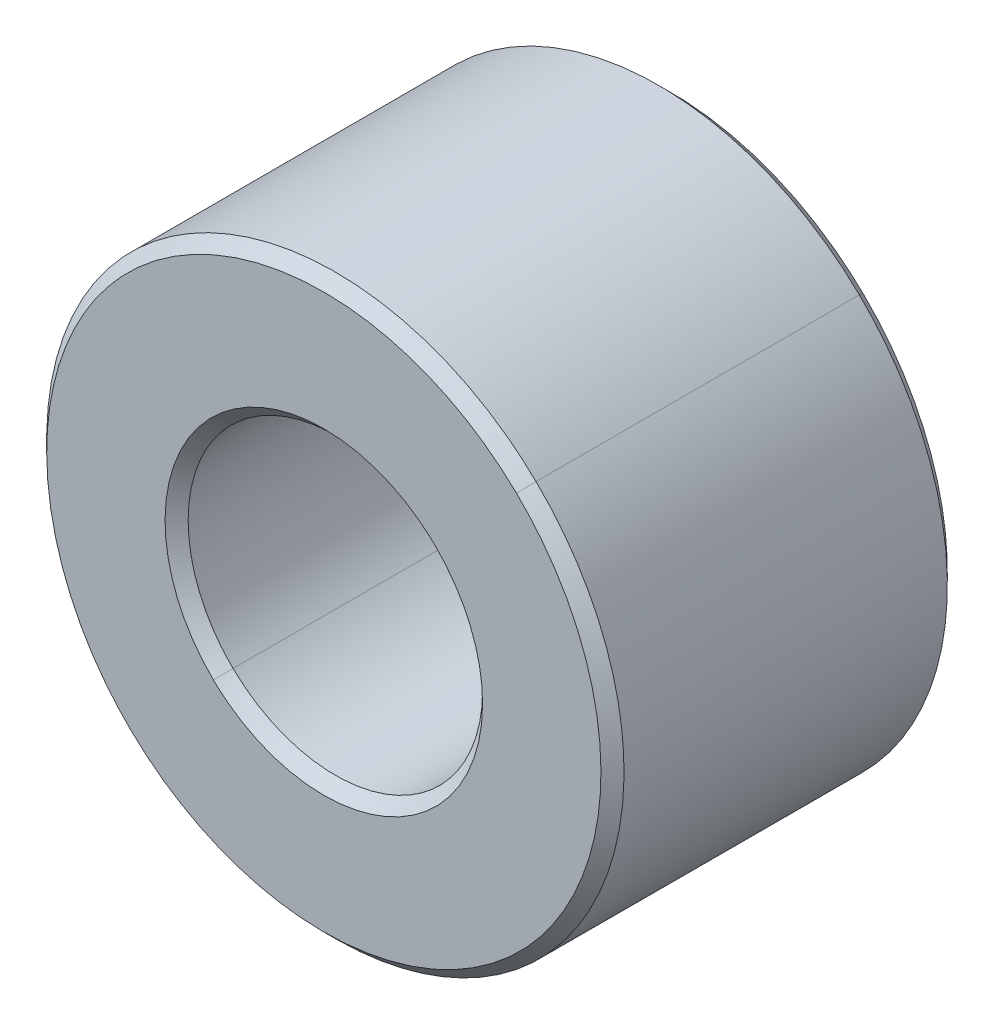
ISO-10303-21;
HEADER;
FILE_DESCRIPTION(('STEP AP214'),'2;1');
FILE_NAME('part.step','',(''),(''),'','','');
FILE_SCHEMA(('AUTOMOTIVE_DESIGN { 1 0 10303 214 1 1 1 1 }'));
ENDSEC;
DATA;
#1=APPLICATION_CONTEXT('core data for automotive mechanical design processes');
#2=APPLICATION_PROTOCOL_DEFINITION('international standard','automotive_design',2000,#1);
#3=PRODUCT_CONTEXT('',#1,'mechanical');
#4=PRODUCT('Part','Part','',(#3));
#5=PRODUCT_RELATED_PRODUCT_CATEGORY('part','',(#4));
#6=PRODUCT_DEFINITION_FORMATION('','',#4);
#7=PRODUCT_DEFINITION_CONTEXT('part definition',#1,'design');
#8=PRODUCT_DEFINITION('design','',#6,#7);
#9=PRODUCT_DEFINITION_SHAPE('','',#8);
#10=(LENGTH_UNIT() NAMED_UNIT(*) SI_UNIT(.MILLI.,.METRE.));
#11=(NAMED_UNIT(*) PLANE_ANGLE_UNIT() SI_UNIT($,.RADIAN.));
#12=(NAMED_UNIT(*) SI_UNIT($,.STERADIAN.) SOLID_ANGLE_UNIT());
#13=UNCERTAINTY_MEASURE_WITH_UNIT(LENGTH_MEASURE(1.E-05),#10,'distance_accuracy_value','');
#14=(GEOMETRIC_REPRESENTATION_CONTEXT(3) GLOBAL_UNCERTAINTY_ASSIGNED_CONTEXT((#13)) GLOBAL_UNIT_ASSIGNED_CONTEXT((#10,
#11,#12)) REPRESENTATION_CONTEXT('',''));
#15=CARTESIAN_POINT('',(0.,0.,0.));
#16=DIRECTION('',(0.,0.,1.));
#17=DIRECTION('',(1.,0.,0.));
#18=AXIS2_PLACEMENT_3D('',#15,#16,#17);
#19=CARTESIAN_POINT('',(212.552183604006,-419.836966821952,256.381305856301));
#20=CARTESIAN_POINT('',(212.691221182538,-419.693201207996,256.581305856301));
#21=CARTESIAN_POINT('',(209.101808869065,-416.500064937198,256.381305856301));
#22=CARTESIAN_POINT('',(209.09708083364,-416.21726174471,256.581305856301));
#23=CARTESIAN_POINT('',(205.76490698431,-419.950439672139,256.381305856301));
#24=CARTESIAN_POINT('',(205.621141370354,-419.811402093608,256.581305856301));
#25=CARTESIAN_POINT('',(202.428005099556,-423.400814407081,256.381305856301));
#26=CARTESIAN_POINT('',(202.145201907068,-423.405542442505,256.581305856301));
#27=CARTESIAN_POINT('',(205.878379834497,-426.737716291835,256.381305856301));
#28=CARTESIAN_POINT('',(205.739342255966,-426.881481905791,256.581305856301));
#29=(BOUNDED_SURFACE() B_SPLINE_SURFACE(2,1,((#19,#20),(#21,#22),(#23,#24),(#25,#26),(#27,#28)),
.UNSPECIFIED.,.F.,.F.,.F.) B_SPLINE_SURFACE_WITH_KNOTS((3,2,3),(2,2),(1.57079632679488,
3.14159265358979,4.71238898038471),(0.,0.282842712474619),
.UNSPECIFIED.) GEOMETRIC_REPRESENTATION_ITEM() RATIONAL_B_SPLINE_SURFACE(((1.,1.),
(0.707106781186541,0.707106781186541),(1.,1.),(0.707106781186541,0.707106781186541),(1.,1.))) REPRESENTATION_ITEM('') SURFACE());
#30=CARTESIAN_POINT('',(205.878379834497,-426.737716291835,256.381305856301));
#31=CARTESIAN_POINT('',(205.739342255966,-426.881481905791,256.581305856301));
#32=(BOUNDED_CURVE() B_SPLINE_CURVE(1,(#30,#31),.UNSPECIFIED.,.F.,
.F.) B_SPLINE_CURVE_WITH_KNOTS((2,2),(0.,0.282842712474629),
.UNSPECIFIED.) CURVE() GEOMETRIC_REPRESENTATION_ITEM() RATIONAL_B_SPLINE_CURVE((1.,1.)) REPRESENTATION_ITEM(''));
#33=CARTESIAN_POINT('',(205.878379834497,-426.737716291835,256.381305856301));
#34=VERTEX_POINT('',#33);
#35=CARTESIAN_POINT('',(205.739342255966,-426.881481905791,256.581305856301));
#36=VERTEX_POINT('',#35);
#37=EDGE_CURVE('E233',#34,#36,#32,.T.);
#38=CARTESIAN_POINT('',(212.691221182538,-419.693201207996,256.581305856301));
#39=CARTESIAN_POINT('',(209.09708083364,-416.21726174471,256.581305856301));
#40=CARTESIAN_POINT('',(205.621141370354,-419.811402093608,256.581305856301));
#41=CARTESIAN_POINT('',(202.145201907068,-423.405542442505,256.581305856301));
#42=CARTESIAN_POINT('',(205.739342255966,-426.881481905791,256.581305856301));
#43=(BOUNDED_CURVE() B_SPLINE_CURVE(2,(#38,#39,#40,#41,#42),.UNSPECIFIED.,.F.,
.F.) B_SPLINE_CURVE_WITH_KNOTS((3,2,3),(0.,7.85398163397448,15.707963267949),
.UNSPECIFIED.) CURVE() GEOMETRIC_REPRESENTATION_ITEM() RATIONAL_B_SPLINE_CURVE((1.,
0.707106781186548,1.,0.707106781186548,1.)) REPRESENTATION_ITEM(''));
#44=CARTESIAN_POINT('',(212.691221182538,-419.693201207996,256.581305856301));
#45=VERTEX_POINT('',#44);
#46=EDGE_CURVE('E277',#45,#36,#43,.T.);
#47=CARTESIAN_POINT('',(212.552183604006,-419.836966821952,256.381305856301));
#48=CARTESIAN_POINT('',(212.691221182538,-419.693201207996,256.581305856301));
#49=(BOUNDED_CURVE() B_SPLINE_CURVE(1,(#47,#48),.UNSPECIFIED.,.F.,
.F.) B_SPLINE_CURVE_WITH_KNOTS((2,2),(0.,0.282842712474629),
.UNSPECIFIED.) CURVE() GEOMETRIC_REPRESENTATION_ITEM() RATIONAL_B_SPLINE_CURVE((1.,1.)) REPRESENTATION_ITEM(''));
#50=CARTESIAN_POINT('',(212.552183604006,-419.836966821952,256.381305856301));
#51=VERTEX_POINT('',#50);
#52=EDGE_CURVE('E242',#51,#45,#49,.T.);
#53=CARTESIAN_POINT('',(205.878379834497,-426.737716291835,256.381305856301));
#54=CARTESIAN_POINT('',(202.428005099556,-423.400814407081,256.381305856301));
#55=CARTESIAN_POINT('',(205.76490698431,-419.950439672139,256.381305856301));
#56=CARTESIAN_POINT('',(209.101808869065,-416.500064937198,256.381305856301));
#57=CARTESIAN_POINT('',(212.552183604006,-419.836966821952,256.381305856301));
#58=(BOUNDED_CURVE() B_SPLINE_CURVE(2,(#53,#54,#55,#56,#57),.UNSPECIFIED.,.F.,
.F.) B_SPLINE_CURVE_WITH_KNOTS((3,2,3),(0.,7.5398223686155,15.079644737231),
.UNSPECIFIED.) CURVE() GEOMETRIC_REPRESENTATION_ITEM() RATIONAL_B_SPLINE_CURVE((1.,
0.707106781186548,1.,0.707106781186548,1.)) REPRESENTATION_ITEM(''));
#59=EDGE_CURVE('E574',#34,#51,#58,.T.);
#60=ORIENTED_EDGE('',*,*,#37,.T.);
#61=ORIENTED_EDGE('',*,*,#46,.F.);
#62=ORIENTED_EDGE('',*,*,#52,.F.);
#63=ORIENTED_EDGE('',*,*,#59,.F.);
#64=EDGE_LOOP('',(#60,#61,#62,#63));
#65=FACE_BOUND('',#64,.T.);
#66=ADVANCED_FACE('F51',(#65),#29,.T.);
#67=CARTESIAN_POINT('',(207.442552592976,-425.120353134831,256.581305856301));
#68=CARTESIAN_POINT('',(205.609541015038,-423.347624008555,256.581305856301));
#69=CARTESIAN_POINT('',(207.382270141314,-421.514612430618,256.581305856301));
#70=CARTESIAN_POINT('',(209.15499926759,-419.68160085268,256.581305856301));
#71=CARTESIAN_POINT('',(210.988010845528,-421.454329978956,256.581305856301));
#72=CARTESIAN_POINT('',(207.303515014444,-425.264118748787,256.381305856301));
#73=CARTESIAN_POINT('',(205.326737822551,-423.35235204398,256.381305856301));
#74=CARTESIAN_POINT('',(207.238504527358,-421.375574852086,256.381305856301));
#75=CARTESIAN_POINT('',(209.150271232165,-419.398797660193,256.381305856301));
#76=CARTESIAN_POINT('',(211.127048424059,-421.310564365,256.381305856301));
#77=(BOUNDED_SURFACE() B_SPLINE_SURFACE(1,2,((#67,#68,#69,#70,#71),(#72,#73,#74,#75,#76)),
.UNSPECIFIED.,.F.,.F.,.F.) B_SPLINE_SURFACE_WITH_KNOTS((2,2),(3,2,3),(0.,0.282842712474621),
(1.5707963267949,3.14159265358979,4.71238898038469),
.UNSPECIFIED.) GEOMETRIC_REPRESENTATION_ITEM() RATIONAL_B_SPLINE_SURFACE(((1.,0.707106781186548,
1.,0.707106781186548,1.),(1.,0.707106781186548,1.,0.707106781186548,1.))) REPRESENTATION_ITEM('') SURFACE());
#78=CARTESIAN_POINT('',(210.988010845528,-421.454329978956,256.581305856301));
#79=CARTESIAN_POINT('',(211.127048424059,-421.310564365,256.381305856301));
#80=(BOUNDED_CURVE() B_SPLINE_CURVE(1,(#78,#79),.UNSPECIFIED.,.F.,
.F.) B_SPLINE_CURVE_WITH_KNOTS((2,2),(0.,0.282842712474615),
.UNSPECIFIED.) CURVE() GEOMETRIC_REPRESENTATION_ITEM() RATIONAL_B_SPLINE_CURVE((1.,1.)) REPRESENTATION_ITEM(''));
#81=CARTESIAN_POINT('',(210.988010845528,-421.454329978956,256.581305856301));
#82=VERTEX_POINT('',#81);
#83=CARTESIAN_POINT('',(211.127048424059,-421.310564365,256.381305856301));
#84=VERTEX_POINT('',#83);
#85=EDGE_CURVE('E122',#82,#84,#80,.T.);
#86=CARTESIAN_POINT('',(207.442552592976,-425.120353134831,256.581305856301));
#87=CARTESIAN_POINT('',(205.609541015038,-423.347624008555,256.581305856301));
#88=CARTESIAN_POINT('',(207.382270141314,-421.514612430618,256.581305856301));
#89=CARTESIAN_POINT('',(209.15499926759,-419.68160085268,256.581305856301));
#90=CARTESIAN_POINT('',(210.988010845528,-421.454329978956,256.581305856301));
#91=(BOUNDED_CURVE() B_SPLINE_CURVE(2,(#86,#87,#88,#89,#90),.UNSPECIFIED.,.F.,
.F.) B_SPLINE_CURVE_WITH_KNOTS((3,2,3),(0.,4.00553063332699,8.01106126665397),
.UNSPECIFIED.) CURVE() GEOMETRIC_REPRESENTATION_ITEM() RATIONAL_B_SPLINE_CURVE((1.,
0.707106781186548,1.,0.707106781186548,1.)) REPRESENTATION_ITEM(''));
#92=CARTESIAN_POINT('',(207.442552592976,-425.120353134831,256.581305856301));
#93=VERTEX_POINT('',#92);
#94=EDGE_CURVE('E57',#93,#82,#91,.T.);
#95=CARTESIAN_POINT('',(207.442552592976,-425.120353134831,256.581305856301));
#96=CARTESIAN_POINT('',(207.303515014444,-425.264118748787,256.381305856301));
#97=(BOUNDED_CURVE() B_SPLINE_CURVE(1,(#95,#96),.UNSPECIFIED.,.F.,
.F.) B_SPLINE_CURVE_WITH_KNOTS((2,2),(0.,0.282842712474615),
.UNSPECIFIED.) CURVE() GEOMETRIC_REPRESENTATION_ITEM() RATIONAL_B_SPLINE_CURVE((1.,1.)) REPRESENTATION_ITEM(''));
#98=CARTESIAN_POINT('',(207.303515014444,-425.264118748787,256.381305856301));
#99=VERTEX_POINT('',#98);
#100=EDGE_CURVE('E243',#93,#99,#97,.T.);
#101=CARTESIAN_POINT('',(211.127048424059,-421.310564365,256.381305856301));
#102=CARTESIAN_POINT('',(209.150271232165,-419.398797660193,256.381305856301));
#103=CARTESIAN_POINT('',(207.238504527358,-421.375574852086,256.381305856301));
#104=CARTESIAN_POINT('',(205.326737822551,-423.35235204398,256.381305856301));
#105=CARTESIAN_POINT('',(207.303515014444,-425.264118748787,256.381305856301));
#106=(BOUNDED_CURVE() B_SPLINE_CURVE(2,(#101,#102,#103,#104,#105),.UNSPECIFIED.,.F.,
.F.) B_SPLINE_CURVE_WITH_KNOTS((3,2,3),(0.,4.31968989868596,8.63937979737192),
.UNSPECIFIED.) CURVE() GEOMETRIC_REPRESENTATION_ITEM() RATIONAL_B_SPLINE_CURVE((1.,
0.707106781186548,1.,0.707106781186548,1.)) REPRESENTATION_ITEM(''));
#107=EDGE_CURVE('E616',#84,#99,#106,.T.);
#108=ORIENTED_EDGE('',*,*,#85,.F.);
#109=ORIENTED_EDGE('',*,*,#94,.F.);
#110=ORIENTED_EDGE('',*,*,#100,.T.);
#111=ORIENTED_EDGE('',*,*,#107,.F.);
#112=EDGE_LOOP('',(#108,#109,#110,#111));
#113=FACE_BOUND('',#112,.T.);
#114=ADVANCED_FACE('F53',(#113),#77,.T.);
#115=CARTESIAN_POINT('',(210.988010845528,-421.454329978956,262.181305856301));
#116=CARTESIAN_POINT('',(209.15499926759,-419.68160085268,262.181305856301));
#117=CARTESIAN_POINT('',(207.382270141314,-421.514612430618,262.181305856301));
#118=CARTESIAN_POINT('',(205.609541015038,-423.347624008555,262.181305856301));
#119=CARTESIAN_POINT('',(207.442552592976,-425.120353134831,262.181305856301));
#120=CARTESIAN_POINT('',(211.127048424059,-421.310564365,262.381305856301));
#121=CARTESIAN_POINT('',(209.150271232165,-419.398797660193,262.381305856301));
#122=CARTESIAN_POINT('',(207.238504527358,-421.375574852086,262.381305856301));
#123=CARTESIAN_POINT('',(205.326737822551,-423.35235204398,262.381305856301));
#124=CARTESIAN_POINT('',(207.303515014444,-425.264118748787,262.381305856301));
#125=(BOUNDED_SURFACE() B_SPLINE_SURFACE(1,2,((#115,#116,#117,#118,#119),(#120,#121,#122,#123,
#124)),.UNSPECIFIED.,.F.,.F.,.F.) B_SPLINE_SURFACE_WITH_KNOTS((2,2),(3,2,3),(-0.282842712474623,
0.),(1.57079632679488,3.14159265358979,4.71238898038471),
.UNSPECIFIED.) GEOMETRIC_REPRESENTATION_ITEM() RATIONAL_B_SPLINE_SURFACE(((1.,0.707106781186541,
1.,0.707106781186541,1.),(1.,0.707106781186541,1.,0.707106781186541,1.))) REPRESENTATION_ITEM('') SURFACE());
#126=CARTESIAN_POINT('',(207.442552592976,-425.120353134831,262.181305856301));
#127=CARTESIAN_POINT('',(207.303515014444,-425.264118748787,262.381305856301));
#128=(BOUNDED_CURVE() B_SPLINE_CURVE(1,(#126,#127),.UNSPECIFIED.,.F.,
.F.) B_SPLINE_CURVE_WITH_KNOTS((2,2),(0.,0.282842712474615),
.UNSPECIFIED.) CURVE() GEOMETRIC_REPRESENTATION_ITEM() RATIONAL_B_SPLINE_CURVE((1.,1.)) REPRESENTATION_ITEM(''));
#129=CARTESIAN_POINT('',(207.442552592976,-425.120353134831,262.181305856301));
#130=VERTEX_POINT('',#129);
#131=CARTESIAN_POINT('',(207.303515014444,-425.264118748787,262.381305856301));
#132=VERTEX_POINT('',#131);
#133=EDGE_CURVE('E123',#130,#132,#128,.T.);
#134=CARTESIAN_POINT('',(210.988010845528,-421.454329978956,262.181305856301));
#135=CARTESIAN_POINT('',(209.15499926759,-419.68160085268,262.181305856301));
#136=CARTESIAN_POINT('',(207.382270141314,-421.514612430618,262.181305856301));
#137=CARTESIAN_POINT('',(205.609541015038,-423.347624008555,262.181305856301));
#138=CARTESIAN_POINT('',(207.442552592976,-425.120353134831,262.181305856301));
#139=(BOUNDED_CURVE() B_SPLINE_CURVE(2,(#134,#135,#136,#137,#138),.UNSPECIFIED.,.F.,
.F.) B_SPLINE_CURVE_WITH_KNOTS((3,2,3),(0.,4.00553063332699,8.01106126665397),
.UNSPECIFIED.) CURVE() GEOMETRIC_REPRESENTATION_ITEM() RATIONAL_B_SPLINE_CURVE((1.,
0.707106781186548,1.,0.707106781186548,1.)) REPRESENTATION_ITEM(''));
#140=CARTESIAN_POINT('',(210.988010845528,-421.454329978956,262.181305856301));
#141=VERTEX_POINT('',#140);
#142=EDGE_CURVE('E11',#141,#130,#139,.T.);
#143=CARTESIAN_POINT('',(210.988010845528,-421.454329978956,262.181305856301));
#144=CARTESIAN_POINT('',(211.127048424059,-421.310564365,262.381305856301));
#145=(BOUNDED_CURVE() B_SPLINE_CURVE(1,(#143,#144),.UNSPECIFIED.,.F.,
.F.) B_SPLINE_CURVE_WITH_KNOTS((2,2),(0.,0.282842712474615),
.UNSPECIFIED.) CURVE() GEOMETRIC_REPRESENTATION_ITEM() RATIONAL_B_SPLINE_CURVE((1.,1.)) REPRESENTATION_ITEM(''));
#146=CARTESIAN_POINT('',(211.127048424059,-421.310564365,262.381305856301));
#147=VERTEX_POINT('',#146);
#148=EDGE_CURVE('E113',#141,#147,#145,.T.);
#149=CARTESIAN_POINT('',(207.303515014444,-425.264118748787,262.381305856301));
#150=CARTESIAN_POINT('',(205.326737822551,-423.35235204398,262.381305856301));
#151=CARTESIAN_POINT('',(207.238504527358,-421.375574852086,262.381305856301));
#152=CARTESIAN_POINT('',(209.150271232165,-419.398797660193,262.381305856301));
#153=CARTESIAN_POINT('',(211.127048424059,-421.310564365,262.381305856301));
#154=(BOUNDED_CURVE() B_SPLINE_CURVE(2,(#149,#150,#151,#152,#153),.UNSPECIFIED.,.F.,
.F.) B_SPLINE_CURVE_WITH_KNOTS((3,2,3),(0.,4.31968989868596,8.63937979737192),
.UNSPECIFIED.) CURVE() GEOMETRIC_REPRESENTATION_ITEM() RATIONAL_B_SPLINE_CURVE((1.,
0.707106781186549,1.,0.707106781186549,1.)) REPRESENTATION_ITEM(''));
#155=EDGE_CURVE('E118',#132,#147,#154,.T.);
#156=ORIENTED_EDGE('',*,*,#133,.F.);
#157=ORIENTED_EDGE('',*,*,#142,.F.);
#158=ORIENTED_EDGE('',*,*,#148,.T.);
#159=ORIENTED_EDGE('',*,*,#155,.F.);
#160=EDGE_LOOP('',(#156,#157,#158,#159));
#161=FACE_BOUND('',#160,.T.);
#162=ADVANCED_FACE('F116',(#161),#125,.T.);
#163=CARTESIAN_POINT('',(205.878379834497,-426.737716291835,262.381305856301));
#164=CARTESIAN_POINT('',(205.739342255966,-426.881481905791,262.181305856301));
#165=CARTESIAN_POINT('',(202.428005099556,-423.40081440708,262.381305856301));
#166=CARTESIAN_POINT('',(202.145201907068,-423.405542442505,262.181305856301));
#167=CARTESIAN_POINT('',(205.76490698431,-419.950439672139,262.381305856301));
#168=CARTESIAN_POINT('',(205.621141370354,-419.811402093608,262.181305856301));
#169=CARTESIAN_POINT('',(209.101808869065,-416.500064937198,262.381305856301));
#170=CARTESIAN_POINT('',(209.09708083364,-416.21726174471,262.181305856301));
#171=CARTESIAN_POINT('',(212.552183604006,-419.836966821952,262.381305856301));
#172=CARTESIAN_POINT('',(212.691221182538,-419.693201207996,262.181305856301));
#173=(BOUNDED_SURFACE() B_SPLINE_SURFACE(2,1,((#163,#164),(#165,#166),(#167,#168),(#169,#170),
(#171,#172)),.UNSPECIFIED.,.F.,.F.,.F.) B_SPLINE_SURFACE_WITH_KNOTS((3,2,3),(2,2),
(1.5707963267949,3.14159265358979,4.71238898038469),(-0.282842712474616,0.),
.UNSPECIFIED.) GEOMETRIC_REPRESENTATION_ITEM() RATIONAL_B_SPLINE_SURFACE(((1.,1.),
(0.707106781186548,0.707106781186548),(1.,1.),(0.707106781186548,0.707106781186548),(1.,1.))) REPRESENTATION_ITEM('') SURFACE());
#174=CARTESIAN_POINT('',(212.552183604006,-419.836966821952,262.381305856301));
#175=CARTESIAN_POINT('',(212.691221182538,-419.693201207996,262.181305856301));
#176=(BOUNDED_CURVE() B_SPLINE_CURVE(1,(#174,#175),.UNSPECIFIED.,.F.,
.F.) B_SPLINE_CURVE_WITH_KNOTS((2,2),(0.,0.282842712474629),
.UNSPECIFIED.) CURVE() GEOMETRIC_REPRESENTATION_ITEM() RATIONAL_B_SPLINE_CURVE((1.,1.)) REPRESENTATION_ITEM(''));
#177=CARTESIAN_POINT('',(212.552183604006,-419.836966821952,262.381305856301));
#178=VERTEX_POINT('',#177);
#179=CARTESIAN_POINT('',(212.691221182538,-419.693201207996,262.181305856301));
#180=VERTEX_POINT('',#179);
#181=EDGE_CURVE('E177',#178,#180,#176,.T.);
#182=CARTESIAN_POINT('',(205.739342255966,-426.881481905791,262.181305856301));
#183=CARTESIAN_POINT('',(202.145201907068,-423.405542442505,262.181305856301));
#184=CARTESIAN_POINT('',(205.621141370354,-419.811402093608,262.181305856301));
#185=CARTESIAN_POINT('',(209.09708083364,-416.21726174471,262.181305856301));
#186=CARTESIAN_POINT('',(212.691221182538,-419.693201207996,262.181305856301));
#187=(BOUNDED_CURVE() B_SPLINE_CURVE(2,(#182,#183,#184,#185,#186),.UNSPECIFIED.,.F.,
.F.) B_SPLINE_CURVE_WITH_KNOTS((3,2,3),(0.,7.85398163397448,15.707963267949),
.UNSPECIFIED.) CURVE() GEOMETRIC_REPRESENTATION_ITEM() RATIONAL_B_SPLINE_CURVE((1.,
0.707106781186548,1.,0.707106781186548,1.)) REPRESENTATION_ITEM(''));
#188=CARTESIAN_POINT('',(205.739342255966,-426.881481905791,262.181305856301));
#189=VERTEX_POINT('',#188);
#190=EDGE_CURVE('E268',#189,#180,#187,.T.);
#191=CARTESIAN_POINT('',(205.878379834497,-426.737716291835,262.381305856301));
#192=CARTESIAN_POINT('',(205.739342255966,-426.881481905791,262.181305856301));
#193=(BOUNDED_CURVE() B_SPLINE_CURVE(1,(#191,#192),.UNSPECIFIED.,.F.,
.F.) B_SPLINE_CURVE_WITH_KNOTS((2,2),(0.,0.282842712474629),
.UNSPECIFIED.) CURVE() GEOMETRIC_REPRESENTATION_ITEM() RATIONAL_B_SPLINE_CURVE((1.,1.)) REPRESENTATION_ITEM(''));
#194=CARTESIAN_POINT('',(205.878379834497,-426.737716291835,262.381305856301));
#195=VERTEX_POINT('',#194);
#196=EDGE_CURVE('E195',#195,#189,#193,.T.);
#197=CARTESIAN_POINT('',(212.552183604006,-419.836966821952,262.381305856301));
#198=CARTESIAN_POINT('',(209.101808869065,-416.500064937198,262.381305856301));
#199=CARTESIAN_POINT('',(205.76490698431,-419.950439672139,262.381305856301));
#200=CARTESIAN_POINT('',(202.428005099556,-423.400814407081,262.381305856301));
#201=CARTESIAN_POINT('',(205.878379834497,-426.737716291835,262.381305856301));
#202=(BOUNDED_CURVE() B_SPLINE_CURVE(2,(#197,#198,#199,#200,#201),.UNSPECIFIED.,.F.,
.F.) B_SPLINE_CURVE_WITH_KNOTS((3,2,3),(0.,7.5398223686155,15.079644737231),
.UNSPECIFIED.) CURVE() GEOMETRIC_REPRESENTATION_ITEM() RATIONAL_B_SPLINE_CURVE((1.,
0.707106781186548,1.,0.707106781186548,1.)) REPRESENTATION_ITEM(''));
#203=EDGE_CURVE('E135',#178,#195,#202,.T.);
#204=ORIENTED_EDGE('',*,*,#181,.T.);
#205=ORIENTED_EDGE('',*,*,#190,.F.);
#206=ORIENTED_EDGE('',*,*,#196,.F.);
#207=ORIENTED_EDGE('',*,*,#203,.F.);
#208=EDGE_LOOP('',(#204,#205,#206,#207));
#209=FACE_BOUND('',#208,.T.);
#210=ADVANCED_FACE('F317',(#209),#173,.T.);
#211=CARTESIAN_POINT('',(210.988010845527,-421.454329978956,256.581305856301));
#212=CARTESIAN_POINT('',(209.15499926759,-419.68160085268,256.581305856301));
#213=CARTESIAN_POINT('',(207.382270141314,-421.514612430618,256.581305856301));
#214=CARTESIAN_POINT('',(205.609541015038,-423.347624008555,256.581305856301));
#215=CARTESIAN_POINT('',(207.442552592976,-425.120353134831,256.581305856301));
#216=CARTESIAN_POINT('',(210.988010845527,-421.454329978956,262.181305856301));
#217=CARTESIAN_POINT('',(209.15499926759,-419.68160085268,262.181305856301));
#218=CARTESIAN_POINT('',(207.382270141314,-421.514612430618,262.181305856301));
#219=CARTESIAN_POINT('',(205.609541015038,-423.347624008555,262.181305856301));
#220=CARTESIAN_POINT('',(207.442552592976,-425.120353134831,262.181305856301));
#221=(BOUNDED_SURFACE() B_SPLINE_SURFACE(1,2,((#211,#212,#213,#214,#215),(#216,#217,#218,#219,
#220)),.UNSPECIFIED.,.F.,.F.,.F.) B_SPLINE_SURFACE_WITH_KNOTS((2,2),(3,2,3),(0.2,5.8),
(1.5707963267949,3.14159265358979,4.71238898038469),
.UNSPECIFIED.) GEOMETRIC_REPRESENTATION_ITEM() RATIONAL_B_SPLINE_SURFACE(((1.,0.707106781186548,
1.,0.707106781186548,1.),(1.,0.707106781186548,1.,0.707106781186548,1.))) REPRESENTATION_ITEM('') SURFACE());
#222=CARTESIAN_POINT('',(207.442552592976,-425.120353134831,256.581305856301));
#223=CARTESIAN_POINT('',(207.442552592976,-425.120353134831,262.181305856301));
#224=(BOUNDED_CURVE() B_SPLINE_CURVE(1,(#222,#223),.UNSPECIFIED.,.F.,
.F.) B_SPLINE_CURVE_WITH_KNOTS((2,2),(0.,5.6),
.UNSPECIFIED.) CURVE() GEOMETRIC_REPRESENTATION_ITEM() RATIONAL_B_SPLINE_CURVE((1.,1.)) REPRESENTATION_ITEM(''));
#225=EDGE_CURVE('E204',#93,#130,#224,.T.);
#226=CARTESIAN_POINT('',(210.988010845528,-421.454329978956,256.581305856301));
#227=CARTESIAN_POINT('',(210.988010845528,-421.454329978956,262.181305856301));
#228=(BOUNDED_CURVE() B_SPLINE_CURVE(1,(#226,#227),.UNSPECIFIED.,.F.,
.F.) B_SPLINE_CURVE_WITH_KNOTS((2,2),(0.,5.6),
.UNSPECIFIED.) CURVE() GEOMETRIC_REPRESENTATION_ITEM() RATIONAL_B_SPLINE_CURVE((1.,1.)) REPRESENTATION_ITEM(''));
#229=EDGE_CURVE('E178',#82,#141,#228,.T.);
#230=ORIENTED_EDGE('',*,*,#225,.F.);
#231=ORIENTED_EDGE('',*,*,#94,.T.);
#232=ORIENTED_EDGE('',*,*,#229,.T.);
#233=ORIENTED_EDGE('',*,*,#142,.T.);
#234=EDGE_LOOP('',(#230,#231,#232,#233));
#235=FACE_BOUND('',#234,.T.);
#236=ADVANCED_FACE('F324',(#235),#221,.T.);
#237=CARTESIAN_POINT('',(212.691221182538,-419.693201207996,256.581305856301));
#238=CARTESIAN_POINT('',(212.691221182538,-419.693201207996,262.181305856301));
#239=CARTESIAN_POINT('',(209.09708083364,-416.21726174471,256.581305856301));
#240=CARTESIAN_POINT('',(209.09708083364,-416.21726174471,262.181305856301));
#241=CARTESIAN_POINT('',(205.621141370354,-419.811402093608,256.581305856301));
#242=CARTESIAN_POINT('',(205.621141370354,-419.811402093608,262.181305856301));
#243=CARTESIAN_POINT('',(202.145201907068,-423.405542442505,256.581305856301));
#244=CARTESIAN_POINT('',(202.145201907068,-423.405542442505,262.181305856301));
#245=CARTESIAN_POINT('',(205.739342255966,-426.881481905791,256.581305856301));
#246=CARTESIAN_POINT('',(205.739342255966,-426.881481905791,262.181305856301));
#247=(BOUNDED_SURFACE() B_SPLINE_SURFACE(2,1,((#237,#238),(#239,#240),(#241,#242),(#243,#244),
(#245,#246)),.UNSPECIFIED.,.F.,.F.,.F.) B_SPLINE_SURFACE_WITH_KNOTS((3,2,3),(2,2),
(1.5707963267949,3.14159265358979,4.71238898038469),(0.2,5.8),
.UNSPECIFIED.) GEOMETRIC_REPRESENTATION_ITEM() RATIONAL_B_SPLINE_SURFACE(((1.,1.),
(0.707106781186548,0.707106781186548),(1.,1.),(0.707106781186548,0.707106781186548),(1.,1.))) REPRESENTATION_ITEM('') SURFACE());
#248=CARTESIAN_POINT('',(205.739342255966,-426.881481905791,256.581305856301));
#249=CARTESIAN_POINT('',(205.739342255966,-426.881481905791,262.181305856301));
#250=(BOUNDED_CURVE() B_SPLINE_CURVE(1,(#248,#249),.UNSPECIFIED.,.F.,
.F.) B_SPLINE_CURVE_WITH_KNOTS((2,2),(0.,5.6),
.UNSPECIFIED.) CURVE() GEOMETRIC_REPRESENTATION_ITEM() RATIONAL_B_SPLINE_CURVE((1.,1.)) REPRESENTATION_ITEM(''));
#251=EDGE_CURVE('E130',#36,#189,#250,.T.);
#252=CARTESIAN_POINT('',(212.691221182538,-419.693201207996,256.581305856301));
#253=CARTESIAN_POINT('',(212.691221182538,-419.693201207996,262.181305856301));
#254=(BOUNDED_CURVE() B_SPLINE_CURVE(1,(#252,#253),.UNSPECIFIED.,.F.,
.F.) B_SPLINE_CURVE_WITH_KNOTS((2,2),(0.,5.6),
.UNSPECIFIED.) CURVE() GEOMETRIC_REPRESENTATION_ITEM() RATIONAL_B_SPLINE_CURVE((1.,1.)) REPRESENTATION_ITEM(''));
#255=EDGE_CURVE('E167',#45,#180,#254,.T.);
#256=ORIENTED_EDGE('',*,*,#251,.T.);
#257=ORIENTED_EDGE('',*,*,#190,.T.);
#258=ORIENTED_EDGE('',*,*,#255,.F.);
#259=ORIENTED_EDGE('',*,*,#46,.T.);
#260=EDGE_LOOP('',(#256,#257,#258,#259));
#261=FACE_BOUND('',#260,.T.);
#262=ADVANCED_FACE('F333',(#261),#247,.T.);
#263=CARTESIAN_POINT('',(205.878379834497,-426.737716291835,256.381305856301));
#264=CARTESIAN_POINT('',(205.739342255966,-426.881481905791,256.581305856301));
#265=CARTESIAN_POINT('',(209.328754569439,-430.07461817659,256.381305856301));
#266=CARTESIAN_POINT('',(209.333482604863,-430.357421369077,256.581305856301));
#267=CARTESIAN_POINT('',(212.665656454193,-426.624243441648,256.381305856301));
#268=CARTESIAN_POINT('',(212.809422068149,-426.76328102018,256.581305856301));
#269=CARTESIAN_POINT('',(216.002558338948,-423.173868706707,256.381305856301));
#270=CARTESIAN_POINT('',(216.285361531435,-423.169140671282,256.581305856301));
#271=CARTESIAN_POINT('',(212.552183604006,-419.836966821952,256.381305856301));
#272=CARTESIAN_POINT('',(212.691221182538,-419.693201207996,256.581305856301));
#273=(BOUNDED_SURFACE() B_SPLINE_SURFACE(2,1,((#263,#264),(#265,#266),(#267,#268),(#269,#270),
(#271,#272)),.UNSPECIFIED.,.F.,.F.,.F.) B_SPLINE_SURFACE_WITH_KNOTS((3,2,3),(2,2),
(1.57079632679489,3.14159265358979,4.7123889803847),(0.,0.282842712474619),
.UNSPECIFIED.) GEOMETRIC_REPRESENTATION_ITEM() RATIONAL_B_SPLINE_SURFACE(((1.,1.),
(0.707106781186544,0.707106781186544),(1.,1.),(0.707106781186544,0.707106781186544),(1.,1.))) REPRESENTATION_ITEM('') SURFACE());
#274=CARTESIAN_POINT('',(212.552183604006,-419.836966821952,256.381305856301));
#275=CARTESIAN_POINT('',(216.002558338948,-423.173868706707,256.381305856301));
#276=CARTESIAN_POINT('',(212.665656454193,-426.624243441648,256.381305856301));
#277=CARTESIAN_POINT('',(209.328754569439,-430.07461817659,256.381305856301));
#278=CARTESIAN_POINT('',(205.878379834497,-426.737716291835,256.381305856301));
#279=(BOUNDED_CURVE() B_SPLINE_CURVE(2,(#274,#275,#276,#277,#278),.UNSPECIFIED.,.F.,
.F.) B_SPLINE_CURVE_WITH_KNOTS((3,2,3),(0.,7.5398223686155,15.079644737231),
.UNSPECIFIED.) CURVE() GEOMETRIC_REPRESENTATION_ITEM() RATIONAL_B_SPLINE_CURVE((1.,
0.707106781186548,1.,0.707106781186548,1.)) REPRESENTATION_ITEM(''));
#280=EDGE_CURVE('E577',#51,#34,#279,.T.);
#281=CARTESIAN_POINT('',(205.739342255966,-426.881481905791,256.581305856301));
#282=CARTESIAN_POINT('',(209.333482604863,-430.357421369077,256.581305856301));
#283=CARTESIAN_POINT('',(212.809422068149,-426.76328102018,256.581305856301));
#284=CARTESIAN_POINT('',(216.285361531435,-423.169140671282,256.581305856301));
#285=CARTESIAN_POINT('',(212.691221182538,-419.693201207996,256.581305856301));
#286=(BOUNDED_CURVE() B_SPLINE_CURVE(2,(#281,#282,#283,#284,#285),.UNSPECIFIED.,.F.,
.F.) B_SPLINE_CURVE_WITH_KNOTS((3,2,3),(0.,7.85398163397448,15.707963267949),
.UNSPECIFIED.) CURVE() GEOMETRIC_REPRESENTATION_ITEM() RATIONAL_B_SPLINE_CURVE((1.,
0.707106781186548,1.,0.707106781186548,1.)) REPRESENTATION_ITEM(''));
#287=EDGE_CURVE('E158',#36,#45,#286,.T.);
#288=ORIENTED_EDGE('',*,*,#37,.F.);
#289=ORIENTED_EDGE('',*,*,#280,.F.);
#290=ORIENTED_EDGE('',*,*,#52,.T.);
#291=ORIENTED_EDGE('',*,*,#287,.F.);
#292=EDGE_LOOP('',(#288,#289,#290,#291));
#293=FACE_BOUND('',#292,.T.);
#294=ADVANCED_FACE('F338',(#293),#273,.T.);
#295=CARTESIAN_POINT('',(210.988010845527,-421.454329978956,256.581305856301));
#296=CARTESIAN_POINT('',(212.821022423465,-423.227059105232,256.581305856301));
#297=CARTESIAN_POINT('',(211.048293297189,-425.060070683169,256.581305856301));
#298=CARTESIAN_POINT('',(209.275564170913,-426.893082261107,256.581305856301));
#299=CARTESIAN_POINT('',(207.442552592976,-425.120353134831,256.581305856301));
#300=CARTESIAN_POINT('',(211.127048424059,-421.310564365,256.381305856301));
#301=CARTESIAN_POINT('',(213.103825615952,-423.222331069807,256.381305856301));
#302=CARTESIAN_POINT('',(211.192058911145,-425.199108261701,256.381305856301));
#303=CARTESIAN_POINT('',(209.280292206338,-427.175885453594,256.381305856301));
#304=CARTESIAN_POINT('',(207.303515014444,-425.264118748787,256.381305856301));
#305=(BOUNDED_SURFACE() B_SPLINE_SURFACE(1,2,((#295,#296,#297,#298,#299),(#300,#301,#302,#303,
#304)),.UNSPECIFIED.,.F.,.F.,.F.) B_SPLINE_SURFACE_WITH_KNOTS((2,2),(3,2,3),(0.,
0.282842712474621),(1.57079632679488,3.14159265358979,4.71238898038471),
.UNSPECIFIED.) GEOMETRIC_REPRESENTATION_ITEM() RATIONAL_B_SPLINE_SURFACE(((1.,0.707106781186541,
1.,0.707106781186541,1.),(1.,0.707106781186541,1.,0.707106781186541,1.))) REPRESENTATION_ITEM('') SURFACE());
#306=CARTESIAN_POINT('',(207.303515014444,-425.264118748787,256.381305856301));
#307=CARTESIAN_POINT('',(209.280292206338,-427.175885453594,256.381305856301));
#308=CARTESIAN_POINT('',(211.192058911145,-425.199108261701,256.381305856301));
#309=CARTESIAN_POINT('',(213.103825615952,-423.222331069807,256.381305856301));
#310=CARTESIAN_POINT('',(211.127048424059,-421.310564365,256.381305856301));
#311=(BOUNDED_CURVE() B_SPLINE_CURVE(2,(#306,#307,#308,#309,#310),.UNSPECIFIED.,.F.,
.F.) B_SPLINE_CURVE_WITH_KNOTS((3,2,3),(0.,4.31968989868597,8.63937979737194),
.UNSPECIFIED.) CURVE() GEOMETRIC_REPRESENTATION_ITEM() RATIONAL_B_SPLINE_CURVE((1.,
0.707106781186548,1.,0.707106781186548,1.)) REPRESENTATION_ITEM(''));
#312=EDGE_CURVE('E569',#99,#84,#311,.T.);
#313=CARTESIAN_POINT('',(210.988010845528,-421.454329978956,256.581305856301));
#314=CARTESIAN_POINT('',(212.821022423465,-423.227059105232,256.581305856301));
#315=CARTESIAN_POINT('',(211.048293297189,-425.060070683169,256.581305856301));
#316=CARTESIAN_POINT('',(209.275564170913,-426.893082261107,256.581305856301));
#317=CARTESIAN_POINT('',(207.442552592976,-425.120353134831,256.581305856301));
#318=(BOUNDED_CURVE() B_SPLINE_CURVE(2,(#313,#314,#315,#316,#317),.UNSPECIFIED.,.F.,
.F.) B_SPLINE_CURVE_WITH_KNOTS((3,2,3),(0.,4.00553063332698,8.01106126665397),
.UNSPECIFIED.) CURVE() GEOMETRIC_REPRESENTATION_ITEM() RATIONAL_B_SPLINE_CURVE((1.,
0.707106781186548,1.,0.707106781186548,1.)) REPRESENTATION_ITEM(''));
#319=EDGE_CURVE('E168',#82,#93,#318,.T.);
#320=ORIENTED_EDGE('',*,*,#85,.T.);
#321=ORIENTED_EDGE('',*,*,#312,.F.);
#322=ORIENTED_EDGE('',*,*,#100,.F.);
#323=ORIENTED_EDGE('',*,*,#319,.F.);
#324=EDGE_LOOP('',(#320,#321,#322,#323));
#325=FACE_BOUND('',#324,.T.);
#326=ADVANCED_FACE('F342',(#325),#305,.T.);
#327=CARTESIAN_POINT('',(207.442552592976,-425.120353134831,262.181305856301));
#328=CARTESIAN_POINT('',(209.275564170913,-426.893082261107,262.181305856301));
#329=CARTESIAN_POINT('',(211.048293297189,-425.060070683169,262.181305856301));
#330=CARTESIAN_POINT('',(212.821022423465,-423.227059105232,262.181305856301));
#331=CARTESIAN_POINT('',(210.988010845528,-421.454329978956,262.181305856301));
#332=CARTESIAN_POINT('',(207.303515014444,-425.264118748787,262.381305856301));
#333=CARTESIAN_POINT('',(209.280292206338,-427.175885453594,262.381305856301));
#334=CARTESIAN_POINT('',(211.192058911145,-425.199108261701,262.381305856301));
#335=CARTESIAN_POINT('',(213.103825615952,-423.222331069807,262.381305856301));
#336=CARTESIAN_POINT('',(211.127048424059,-421.310564365,262.381305856301));
#337=(BOUNDED_SURFACE() B_SPLINE_SURFACE(1,2,((#327,#328,#329,#330,#331),(#332,#333,#334,#335,
#336)),.UNSPECIFIED.,.F.,.F.,.F.) B_SPLINE_SURFACE_WITH_KNOTS((2,2),(3,2,3),(-0.282842712474623,
0.),(1.57079632679489,3.14159265358979,4.7123889803847),
.UNSPECIFIED.) GEOMETRIC_REPRESENTATION_ITEM() RATIONAL_B_SPLINE_SURFACE(((1.,0.707106781186544,
1.,0.707106781186544,1.),(1.,0.707106781186544,1.,0.707106781186544,1.))) REPRESENTATION_ITEM('') SURFACE());
#338=CARTESIAN_POINT('',(211.127048424059,-421.310564365,262.381305856301));
#339=CARTESIAN_POINT('',(213.103825615952,-423.222331069807,262.381305856301));
#340=CARTESIAN_POINT('',(211.192058911145,-425.199108261701,262.381305856301));
#341=CARTESIAN_POINT('',(209.280292206338,-427.175885453594,262.381305856301));
#342=CARTESIAN_POINT('',(207.303515014444,-425.264118748787,262.381305856301));
#343=(BOUNDED_CURVE() B_SPLINE_CURVE(2,(#338,#339,#340,#341,#342),.UNSPECIFIED.,.F.,
.F.) B_SPLINE_CURVE_WITH_KNOTS((3,2,3),(0.,4.31968989868597,8.63937979737194),
.UNSPECIFIED.) CURVE() GEOMETRIC_REPRESENTATION_ITEM() RATIONAL_B_SPLINE_CURVE((1.,
0.707106781186547,1.,0.707106781186547,1.)) REPRESENTATION_ITEM(''));
#344=EDGE_CURVE('E126',#147,#132,#343,.T.);
#345=CARTESIAN_POINT('',(207.442552592976,-425.120353134831,262.181305856301));
#346=CARTESIAN_POINT('',(209.275564170913,-426.893082261107,262.181305856301));
#347=CARTESIAN_POINT('',(211.048293297189,-425.060070683169,262.181305856301));
#348=CARTESIAN_POINT('',(212.821022423465,-423.227059105232,262.181305856301));
#349=CARTESIAN_POINT('',(210.988010845528,-421.454329978956,262.181305856301));
#350=(BOUNDED_CURVE() B_SPLINE_CURVE(2,(#345,#346,#347,#348,#349),.UNSPECIFIED.,.F.,
.F.) B_SPLINE_CURVE_WITH_KNOTS((3,2,3),(0.,4.00553063332698,8.01106126665397),
.UNSPECIFIED.) CURVE() GEOMETRIC_REPRESENTATION_ITEM() RATIONAL_B_SPLINE_CURVE((1.,
0.707106781186548,1.,0.707106781186548,1.)) REPRESENTATION_ITEM(''));
#351=EDGE_CURVE('E203',#130,#141,#350,.T.);
#352=ORIENTED_EDGE('',*,*,#133,.T.);
#353=ORIENTED_EDGE('',*,*,#344,.F.);
#354=ORIENTED_EDGE('',*,*,#148,.F.);
#355=ORIENTED_EDGE('',*,*,#351,.F.);
#356=EDGE_LOOP('',(#352,#353,#354,#355));
#357=FACE_BOUND('',#356,.T.);
#358=ADVANCED_FACE('F127',(#357),#337,.T.);
#359=CARTESIAN_POINT('',(212.552183604006,-419.836966821952,262.381305856301));
#360=CARTESIAN_POINT('',(212.691221182538,-419.693201207996,262.181305856301));
#361=CARTESIAN_POINT('',(216.002558338948,-423.173868706707,262.381305856301));
#362=CARTESIAN_POINT('',(216.285361531435,-423.169140671282,262.181305856301));
#363=CARTESIAN_POINT('',(212.665656454193,-426.624243441648,262.381305856301));
#364=CARTESIAN_POINT('',(212.809422068149,-426.76328102018,262.181305856301));
#365=CARTESIAN_POINT('',(209.328754569439,-430.07461817659,262.381305856301));
#366=CARTESIAN_POINT('',(209.333482604863,-430.357421369077,262.181305856301));
#367=CARTESIAN_POINT('',(205.878379834497,-426.737716291835,262.381305856301));
#368=CARTESIAN_POINT('',(205.739342255966,-426.881481905791,262.181305856301));
#369=(BOUNDED_SURFACE() B_SPLINE_SURFACE(2,1,((#359,#360),(#361,#362),(#363,#364),(#365,#366),
(#367,#368)),.UNSPECIFIED.,.F.,.F.,.F.) B_SPLINE_SURFACE_WITH_KNOTS((3,2,3),(2,2),
(1.57079632679488,3.14159265358979,4.71238898038471),(-0.282842712474616,0.),
.UNSPECIFIED.) GEOMETRIC_REPRESENTATION_ITEM() RATIONAL_B_SPLINE_SURFACE(((1.,1.),
(0.707106781186541,0.707106781186541),(1.,1.),(0.707106781186541,0.707106781186541),(1.,1.))) REPRESENTATION_ITEM('') SURFACE());
#370=CARTESIAN_POINT('',(205.878379834497,-426.737716291835,262.381305856301));
#371=CARTESIAN_POINT('',(209.328754569439,-430.07461817659,262.381305856301));
#372=CARTESIAN_POINT('',(212.665656454193,-426.624243441648,262.381305856301));
#373=CARTESIAN_POINT('',(216.002558338948,-423.173868706707,262.381305856301));
#374=CARTESIAN_POINT('',(212.552183604006,-419.836966821952,262.381305856301));
#375=(BOUNDED_CURVE() B_SPLINE_CURVE(2,(#370,#371,#372,#373,#374),.UNSPECIFIED.,.F.,
.F.) B_SPLINE_CURVE_WITH_KNOTS((3,2,3),(0.,7.5398223686155,15.079644737231),
.UNSPECIFIED.) CURVE() GEOMETRIC_REPRESENTATION_ITEM() RATIONAL_B_SPLINE_CURVE((1.,
0.707106781186548,1.,0.707106781186548,1.)) REPRESENTATION_ITEM(''));
#376=EDGE_CURVE('E141',#195,#178,#375,.T.);
#377=CARTESIAN_POINT('',(212.691221182538,-419.693201207996,262.181305856301));
#378=CARTESIAN_POINT('',(216.285361531435,-423.169140671282,262.181305856301));
#379=CARTESIAN_POINT('',(212.809422068149,-426.76328102018,262.181305856301));
#380=CARTESIAN_POINT('',(209.333482604863,-430.357421369077,262.181305856301));
#381=CARTESIAN_POINT('',(205.739342255966,-426.881481905791,262.181305856301));
#382=(BOUNDED_CURVE() B_SPLINE_CURVE(2,(#377,#378,#379,#380,#381),.UNSPECIFIED.,.F.,
.F.) B_SPLINE_CURVE_WITH_KNOTS((3,2,3),(0.,7.85398163397448,15.707963267949),
.UNSPECIFIED.) CURVE() GEOMETRIC_REPRESENTATION_ITEM() RATIONAL_B_SPLINE_CURVE((1.,
0.707106781186548,1.,0.707106781186548,1.)) REPRESENTATION_ITEM(''));
#383=EDGE_CURVE('E147',#180,#189,#382,.T.);
#384=ORIENTED_EDGE('',*,*,#181,.F.);
#385=ORIENTED_EDGE('',*,*,#376,.F.);
#386=ORIENTED_EDGE('',*,*,#196,.T.);
#387=ORIENTED_EDGE('',*,*,#383,.F.);
#388=EDGE_LOOP('',(#384,#385,#386,#387));
#389=FACE_BOUND('',#388,.T.);
#390=ADVANCED_FACE('F356',(#389),#369,.T.);
#391=CARTESIAN_POINT('',(207.442552592976,-425.120353134831,256.581305856301));
#392=CARTESIAN_POINT('',(209.275564170913,-426.893082261107,256.581305856301));
#393=CARTESIAN_POINT('',(211.048293297189,-425.060070683169,256.581305856301));
#394=CARTESIAN_POINT('',(212.821022423465,-423.227059105232,256.581305856301));
#395=CARTESIAN_POINT('',(210.988010845527,-421.454329978956,256.581305856301));
#396=CARTESIAN_POINT('',(207.442552592976,-425.120353134831,262.181305856301));
#397=CARTESIAN_POINT('',(209.275564170913,-426.893082261107,262.181305856301));
#398=CARTESIAN_POINT('',(211.048293297189,-425.060070683169,262.181305856301));
#399=CARTESIAN_POINT('',(212.821022423465,-423.227059105232,262.181305856301));
#400=CARTESIAN_POINT('',(210.988010845527,-421.454329978956,262.181305856301));
#401=(BOUNDED_SURFACE() B_SPLINE_SURFACE(1,2,((#391,#392,#393,#394,#395),(#396,#397,#398,#399,
#400)),.UNSPECIFIED.,.F.,.F.,.F.) B_SPLINE_SURFACE_WITH_KNOTS((2,2),(3,2,3),(0.2,5.8),
(1.5707963267949,3.14159265358979,4.71238898038469),
.UNSPECIFIED.) GEOMETRIC_REPRESENTATION_ITEM() RATIONAL_B_SPLINE_SURFACE(((1.,0.707106781186548,
1.,0.707106781186548,1.),(1.,0.707106781186548,1.,0.707106781186548,1.))) REPRESENTATION_ITEM('') SURFACE());
#402=ORIENTED_EDGE('',*,*,#225,.T.);
#403=ORIENTED_EDGE('',*,*,#351,.T.);
#404=ORIENTED_EDGE('',*,*,#229,.F.);
#405=ORIENTED_EDGE('',*,*,#319,.T.);
#406=EDGE_LOOP('',(#402,#403,#404,#405));
#407=FACE_BOUND('',#406,.T.);
#408=ADVANCED_FACE('F360',(#407),#401,.T.);
#409=CARTESIAN_POINT('',(205.739342255966,-426.881481905791,256.581305856301));
#410=CARTESIAN_POINT('',(205.739342255966,-426.881481905791,262.181305856301));
#411=CARTESIAN_POINT('',(209.333482604863,-430.357421369077,256.581305856301));
#412=CARTESIAN_POINT('',(209.333482604863,-430.357421369077,262.181305856301));
#413=CARTESIAN_POINT('',(212.809422068149,-426.76328102018,256.581305856301));
#414=CARTESIAN_POINT('',(212.809422068149,-426.76328102018,262.181305856301));
#415=CARTESIAN_POINT('',(216.285361531435,-423.169140671282,256.581305856301));
#416=CARTESIAN_POINT('',(216.285361531435,-423.169140671282,262.181305856301));
#417=CARTESIAN_POINT('',(212.691221182538,-419.693201207996,256.581305856301));
#418=CARTESIAN_POINT('',(212.691221182538,-419.693201207996,262.181305856301));
#419=(BOUNDED_SURFACE() B_SPLINE_SURFACE(2,1,((#409,#410),(#411,#412),(#413,#414),(#415,#416),
(#417,#418)),.UNSPECIFIED.,.F.,.F.,.F.) B_SPLINE_SURFACE_WITH_KNOTS((3,2,3),(2,2),
(1.5707963267949,3.14159265358979,4.71238898038469),(0.2,5.8),
.UNSPECIFIED.) GEOMETRIC_REPRESENTATION_ITEM() RATIONAL_B_SPLINE_SURFACE(((1.,1.),
(0.707106781186548,0.707106781186548),(1.,1.),(0.707106781186548,0.707106781186548),(1.,1.))) REPRESENTATION_ITEM('') SURFACE());
#420=ORIENTED_EDGE('',*,*,#251,.F.);
#421=ORIENTED_EDGE('',*,*,#287,.T.);
#422=ORIENTED_EDGE('',*,*,#255,.T.);
#423=ORIENTED_EDGE('',*,*,#383,.T.);
#424=EDGE_LOOP('',(#420,#421,#422,#423));
#425=FACE_BOUND('',#424,.T.);
#426=ADVANCED_FACE('F376',(#425),#419,.T.);
#427=CARTESIAN_POINT('',(216.002558338948,-423.173868706707,262.381305856301));
#428=DIRECTION('',(0.,0.,1.));
#429=DIRECTION('',(1.,0.,0.));
#430=AXIS2_PLACEMENT_3D('',#427,#428,#429);
#431=PLANE('',#430);
#432=ORIENTED_EDGE('',*,*,#155,.T.);
#433=ORIENTED_EDGE('',*,*,#344,.T.);
#434=EDGE_LOOP('',(#432,#433));
#435=FACE_BOUND('',#434,.T.);
#436=ORIENTED_EDGE('',*,*,#376,.T.);
#437=ORIENTED_EDGE('',*,*,#203,.T.);
#438=EDGE_LOOP('',(#436,#437));
#439=FACE_BOUND('',#438,.T.);
#440=ADVANCED_FACE('F132',(#435,#439),#431,.T.);
#441=CARTESIAN_POINT('',(216.002558338948,-423.173868706707,256.381305856301));
#442=DIRECTION('',(0.,0.,-1.));
#443=DIRECTION('',(0.,-1.,0.));
#444=AXIS2_PLACEMENT_3D('',#441,#442,#443);
#445=PLANE('',#444);
#446=ORIENTED_EDGE('',*,*,#312,.T.);
#447=ORIENTED_EDGE('',*,*,#107,.T.);
#448=EDGE_LOOP('',(#446,#447));
#449=FACE_BOUND('',#448,.T.);
#450=ORIENTED_EDGE('',*,*,#59,.T.);
#451=ORIENTED_EDGE('',*,*,#280,.T.);
#452=EDGE_LOOP('',(#450,#451));
#453=FACE_BOUND('',#452,.T.);
#454=ADVANCED_FACE('F408',(#449,#453),#445,.T.);
#455=CLOSED_SHELL('',(#66,#114,#162,#210,#236,#262,#294,#326,#358,#390,#408,#426,#440,#454));
#456=MANIFOLD_SOLID_BREP('B2',#455);
#457=ADVANCED_BREP_SHAPE_REPRESENTATION('',(#18,#456),#14);
#458=SHAPE_DEFINITION_REPRESENTATION(#9,#457);
ENDSEC;
END-ISO-10303-21;
